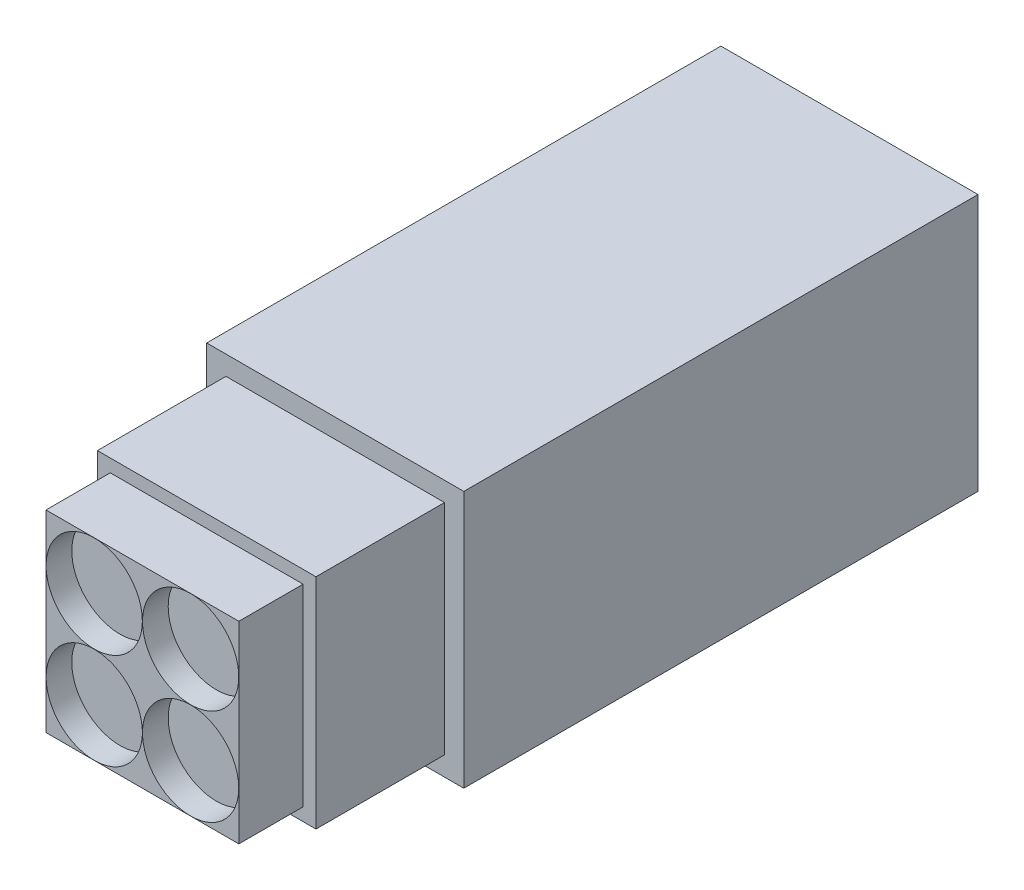
ISO-10303-21;
HEADER;
FILE_DESCRIPTION(('STEP AP214'),'2;1');
FILE_NAME('part.step','',(''),(''),'','','');
FILE_SCHEMA(('AUTOMOTIVE_DESIGN { 1 0 10303 214 1 1 1 1 }'));
ENDSEC;
DATA;
#1=APPLICATION_CONTEXT('core data for automotive mechanical design processes');
#2=APPLICATION_PROTOCOL_DEFINITION('international standard','automotive_design',2000,#1);
#3=PRODUCT_CONTEXT('',#1,'mechanical');
#4=PRODUCT('Part','Part','',(#3));
#5=PRODUCT_RELATED_PRODUCT_CATEGORY('part','',(#4));
#6=PRODUCT_DEFINITION_FORMATION('','',#4);
#7=PRODUCT_DEFINITION_CONTEXT('part definition',#1,'design');
#8=PRODUCT_DEFINITION('design','',#6,#7);
#9=PRODUCT_DEFINITION_SHAPE('','',#8);
#10=(LENGTH_UNIT() NAMED_UNIT(*) SI_UNIT(.MILLI.,.METRE.));
#11=(NAMED_UNIT(*) PLANE_ANGLE_UNIT() SI_UNIT($,.RADIAN.));
#12=(NAMED_UNIT(*) SI_UNIT($,.STERADIAN.) SOLID_ANGLE_UNIT());
#13=UNCERTAINTY_MEASURE_WITH_UNIT(LENGTH_MEASURE(1.E-05),#10,'distance_accuracy_value','');
#14=(GEOMETRIC_REPRESENTATION_CONTEXT(3) GLOBAL_UNCERTAINTY_ASSIGNED_CONTEXT((#13)) GLOBAL_UNIT_ASSIGNED_CONTEXT((#10,
#11,#12)) REPRESENTATION_CONTEXT('',''));
#15=CARTESIAN_POINT('',(0.,0.,0.));
#16=DIRECTION('',(0.,0.,1.));
#17=DIRECTION('',(1.,0.,0.));
#18=AXIS2_PLACEMENT_3D('',#15,#16,#17);
#19=CARTESIAN_POINT('',(10.,9.99999999999998,40.));
#20=DIRECTION('',(-1.,0.,0.));
#21=DIRECTION('',(0.,-1.,0.));
#22=AXIS2_PLACEMENT_3D('',#19,#20,#21);
#23=PLANE('',#22);
#24=DIRECTION('',(0.,1.,0.));
#25=VECTOR('',#24,1.);
#26=CARTESIAN_POINT('',(10.,9.99999999999998,0.));
#27=LINE('',#26,#25);
#28=CARTESIAN_POINT('',(9.99999999999999,-10.,0.));
#29=VERTEX_POINT('',#28);
#30=CARTESIAN_POINT('',(10.,9.99999999999998,0.));
#31=VERTEX_POINT('',#30);
#32=EDGE_CURVE('E202',#29,#31,#27,.T.);
#33=ORIENTED_EDGE('',*,*,#32,.T.);
#34=DIRECTION('',(0.,0.,-1.));
#35=VECTOR('',#34,1.);
#36=CARTESIAN_POINT('',(10.,9.99999999999998,40.));
#37=LINE('',#36,#35);
#38=CARTESIAN_POINT('',(10.,9.99999999999998,40.));
#39=VERTEX_POINT('',#38);
#40=EDGE_CURVE('E11',#39,#31,#37,.T.);
#41=ORIENTED_EDGE('',*,*,#40,.F.);
#42=DIRECTION('',(0.,1.,0.));
#43=VECTOR('',#42,1.);
#44=CARTESIAN_POINT('',(10.,9.99999999999998,40.));
#45=LINE('',#44,#43);
#46=CARTESIAN_POINT('',(9.99999999999999,-10.,40.));
#47=VERTEX_POINT('',#46);
#48=EDGE_CURVE('E203',#47,#39,#45,.T.);
#49=ORIENTED_EDGE('',*,*,#48,.F.);
#50=DIRECTION('',(0.,0.,-1.));
#51=VECTOR('',#50,1.);
#52=CARTESIAN_POINT('',(9.99999999999999,-10.,40.));
#53=LINE('',#52,#51);
#54=EDGE_CURVE('E217',#47,#29,#53,.T.);
#55=ORIENTED_EDGE('',*,*,#54,.T.);
#56=EDGE_LOOP('',(#33,#41,#49,#55));
#57=FACE_BOUND('',#56,.T.);
#58=ADVANCED_FACE('F39',(#57),#23,.F.);
#59=CARTESIAN_POINT('',(-10.,9.99999999999998,40.));
#60=DIRECTION('',(0.,-1.,0.));
#61=DIRECTION('',(0.,0.,-1.));
#62=AXIS2_PLACEMENT_3D('',#59,#60,#61);
#63=PLANE('',#62);
#64=DIRECTION('',(-1.,0.,0.));
#65=VECTOR('',#64,1.);
#66=CARTESIAN_POINT('',(-10.,9.99999999999998,0.));
#67=LINE('',#66,#65);
#68=CARTESIAN_POINT('',(-10.,9.99999999999998,0.));
#69=VERTEX_POINT('',#68);
#70=EDGE_CURVE('E221',#31,#69,#67,.T.);
#71=ORIENTED_EDGE('',*,*,#70,.T.);
#72=DIRECTION('',(0.,0.,-1.));
#73=VECTOR('',#72,1.);
#74=CARTESIAN_POINT('',(-10.,9.99999999999998,40.));
#75=LINE('',#74,#73);
#76=CARTESIAN_POINT('',(-10.,9.99999999999998,40.));
#77=VERTEX_POINT('',#76);
#78=EDGE_CURVE('E47',#77,#69,#75,.T.);
#79=ORIENTED_EDGE('',*,*,#78,.F.);
#80=DIRECTION('',(-1.,0.,0.));
#81=VECTOR('',#80,1.);
#82=CARTESIAN_POINT('',(-10.,9.99999999999998,40.));
#83=LINE('',#82,#81);
#84=EDGE_CURVE('E207',#39,#77,#83,.T.);
#85=ORIENTED_EDGE('',*,*,#84,.F.);
#86=ORIENTED_EDGE('',*,*,#40,.T.);
#87=EDGE_LOOP('',(#71,#79,#85,#86));
#88=FACE_BOUND('',#87,.T.);
#89=ADVANCED_FACE('F257',(#88),#63,.F.);
#90=CARTESIAN_POINT('',(-10.,9.99999999999998,40.));
#91=DIRECTION('',(1.,0.,0.));
#92=DIRECTION('',(0.,0.,-1.));
#93=AXIS2_PLACEMENT_3D('',#90,#91,#92);
#94=PLANE('',#93);
#95=DIRECTION('',(0.,-1.,0.));
#96=VECTOR('',#95,1.);
#97=CARTESIAN_POINT('',(-10.,9.99999999999998,0.));
#98=LINE('',#97,#96);
#99=CARTESIAN_POINT('',(-10.,-10.,0.));
#100=VERTEX_POINT('',#99);
#101=EDGE_CURVE('E224',#69,#100,#98,.T.);
#102=ORIENTED_EDGE('',*,*,#101,.T.);
#103=DIRECTION('',(0.,0.,-1.));
#104=VECTOR('',#103,1.);
#105=CARTESIAN_POINT('',(-10.,-10.,40.));
#106=LINE('',#105,#104);
#107=CARTESIAN_POINT('',(-10.,-10.,40.));
#108=VERTEX_POINT('',#107);
#109=EDGE_CURVE('E232',#108,#100,#106,.T.);
#110=ORIENTED_EDGE('',*,*,#109,.F.);
#111=DIRECTION('',(0.,-1.,0.));
#112=VECTOR('',#111,1.);
#113=CARTESIAN_POINT('',(-10.,9.99999999999998,40.));
#114=LINE('',#113,#112);
#115=EDGE_CURVE('E211',#77,#108,#114,.T.);
#116=ORIENTED_EDGE('',*,*,#115,.F.);
#117=ORIENTED_EDGE('',*,*,#78,.T.);
#118=EDGE_LOOP('',(#102,#110,#116,#117));
#119=FACE_BOUND('',#118,.T.);
#120=ADVANCED_FACE('F241',(#119),#94,.F.);
#121=CARTESIAN_POINT('',(-10.,-10.,40.));
#122=DIRECTION('',(0.,1.,0.));
#123=DIRECTION('',(0.,0.,1.));
#124=AXIS2_PLACEMENT_3D('',#121,#122,#123);
#125=PLANE('',#124);
#126=DIRECTION('',(1.,0.,0.));
#127=VECTOR('',#126,1.);
#128=CARTESIAN_POINT('',(-10.,-10.,0.));
#129=LINE('',#128,#127);
#130=EDGE_CURVE('E208',#100,#29,#129,.T.);
#131=ORIENTED_EDGE('',*,*,#130,.T.);
#132=ORIENTED_EDGE('',*,*,#54,.F.);
#133=DIRECTION('',(1.,0.,0.));
#134=VECTOR('',#133,1.);
#135=CARTESIAN_POINT('',(-10.,-10.,40.));
#136=LINE('',#135,#134);
#137=EDGE_CURVE('E214',#108,#47,#136,.T.);
#138=ORIENTED_EDGE('',*,*,#137,.F.);
#139=ORIENTED_EDGE('',*,*,#109,.T.);
#140=EDGE_LOOP('',(#131,#132,#138,#139));
#141=FACE_BOUND('',#140,.T.);
#142=ADVANCED_FACE('F250',(#141),#125,.F.);
#143=CARTESIAN_POINT('',(0.,0.,40.));
#144=DIRECTION('',(0.,0.,1.));
#145=DIRECTION('',(1.,0.,0.));
#146=AXIS2_PLACEMENT_3D('',#143,#144,#145);
#147=PLANE('',#146);
#148=DIRECTION('',(0.,1.,0.));
#149=VECTOR('',#148,1.);
#150=CARTESIAN_POINT('',(8.5,8.5,40.));
#151=LINE('',#150,#149);
#152=CARTESIAN_POINT('',(8.5,-8.5,40.));
#153=VERTEX_POINT('',#152);
#154=CARTESIAN_POINT('',(8.5,8.5,40.));
#155=VERTEX_POINT('',#154);
#156=EDGE_CURVE('E151',#153,#155,#151,.T.);
#157=ORIENTED_EDGE('',*,*,#156,.F.);
#158=DIRECTION('',(1.,0.,0.));
#159=VECTOR('',#158,1.);
#160=CARTESIAN_POINT('',(-8.5,-8.5,40.));
#161=LINE('',#160,#159);
#162=CARTESIAN_POINT('',(-8.5,-8.5,40.));
#163=VERTEX_POINT('',#162);
#164=EDGE_CURVE('E167',#163,#153,#161,.T.);
#165=ORIENTED_EDGE('',*,*,#164,.F.);
#166=DIRECTION('',(0.,-1.,0.));
#167=VECTOR('',#166,1.);
#168=CARTESIAN_POINT('',(-8.5,8.5,40.));
#169=LINE('',#168,#167);
#170=CARTESIAN_POINT('',(-8.5,8.5,40.));
#171=VERTEX_POINT('',#170);
#172=EDGE_CURVE('E180',#171,#163,#169,.T.);
#173=ORIENTED_EDGE('',*,*,#172,.F.);
#174=DIRECTION('',(-1.,0.,0.));
#175=VECTOR('',#174,1.);
#176=CARTESIAN_POINT('',(-8.5,8.5,40.));
#177=LINE('',#176,#175);
#178=EDGE_CURVE('E156',#155,#171,#177,.T.);
#179=ORIENTED_EDGE('',*,*,#178,.F.);
#180=EDGE_LOOP('',(#157,#165,#173,#179));
#181=FACE_BOUND('',#180,.T.);
#182=ORIENTED_EDGE('',*,*,#48,.T.);
#183=ORIENTED_EDGE('',*,*,#84,.T.);
#184=ORIENTED_EDGE('',*,*,#115,.T.);
#185=ORIENTED_EDGE('',*,*,#137,.T.);
#186=EDGE_LOOP('',(#182,#183,#184,#185));
#187=FACE_BOUND('',#186,.T.);
#188=ADVANCED_FACE('F256',(#181,#187),#147,.T.);
#189=CARTESIAN_POINT('',(0.,0.,0.));
#190=DIRECTION('',(0.,0.,1.));
#191=DIRECTION('',(1.,0.,0.));
#192=AXIS2_PLACEMENT_3D('',#189,#190,#191);
#193=PLANE('',#192);
#194=ORIENTED_EDGE('',*,*,#32,.F.);
#195=ORIENTED_EDGE('',*,*,#130,.F.);
#196=ORIENTED_EDGE('',*,*,#101,.F.);
#197=ORIENTED_EDGE('',*,*,#70,.F.);
#198=EDGE_LOOP('',(#194,#195,#196,#197));
#199=FACE_BOUND('',#198,.T.);
#200=ADVANCED_FACE('F247',(#199),#193,.F.);
#201=CARTESIAN_POINT('',(8.5,8.5,50.));
#202=DIRECTION('',(-1.,0.,0.));
#203=DIRECTION('',(0.,-1.,0.));
#204=AXIS2_PLACEMENT_3D('',#201,#202,#203);
#205=PLANE('',#204);
#206=ORIENTED_EDGE('',*,*,#156,.T.);
#207=DIRECTION('',(0.,0.,-1.));
#208=VECTOR('',#207,1.);
#209=CARTESIAN_POINT('',(8.5,8.5,50.));
#210=LINE('',#209,#208);
#211=CARTESIAN_POINT('',(8.5,8.5,50.));
#212=VERTEX_POINT('',#211);
#213=EDGE_CURVE('E198',#212,#155,#210,.T.);
#214=ORIENTED_EDGE('',*,*,#213,.F.);
#215=DIRECTION('',(0.,1.,0.));
#216=VECTOR('',#215,1.);
#217=CARTESIAN_POINT('',(8.5,8.5,50.));
#218=LINE('',#217,#216);
#219=CARTESIAN_POINT('',(8.5,-8.5,50.));
#220=VERTEX_POINT('',#219);
#221=EDGE_CURVE('E162',#220,#212,#218,.T.);
#222=ORIENTED_EDGE('',*,*,#221,.F.);
#223=DIRECTION('',(0.,0.,-1.));
#224=VECTOR('',#223,1.);
#225=CARTESIAN_POINT('',(8.5,-8.5,50.));
#226=LINE('',#225,#224);
#227=EDGE_CURVE('E175',#220,#153,#226,.T.);
#228=ORIENTED_EDGE('',*,*,#227,.T.);
#229=EDGE_LOOP('',(#206,#214,#222,#228));
#230=FACE_BOUND('',#229,.T.);
#231=ADVANCED_FACE('F269',(#230),#205,.F.);
#232=CARTESIAN_POINT('',(-8.5,8.5,50.));
#233=DIRECTION('',(0.,-1.,0.));
#234=DIRECTION('',(0.,0.,-1.));
#235=AXIS2_PLACEMENT_3D('',#232,#233,#234);
#236=PLANE('',#235);
#237=ORIENTED_EDGE('',*,*,#178,.T.);
#238=DIRECTION('',(0.,0.,-1.));
#239=VECTOR('',#238,1.);
#240=CARTESIAN_POINT('',(-8.5,8.5,50.));
#241=LINE('',#240,#239);
#242=CARTESIAN_POINT('',(-8.5,8.5,50.));
#243=VERTEX_POINT('',#242);
#244=EDGE_CURVE('E194',#243,#171,#241,.T.);
#245=ORIENTED_EDGE('',*,*,#244,.F.);
#246=DIRECTION('',(-1.,0.,0.));
#247=VECTOR('',#246,1.);
#248=CARTESIAN_POINT('',(-8.5,8.5,50.));
#249=LINE('',#248,#247);
#250=EDGE_CURVE('E166',#212,#243,#249,.T.);
#251=ORIENTED_EDGE('',*,*,#250,.F.);
#252=ORIENTED_EDGE('',*,*,#213,.T.);
#253=EDGE_LOOP('',(#237,#245,#251,#252));
#254=FACE_BOUND('',#253,.T.);
#255=ADVANCED_FACE('F275',(#254),#236,.F.);
#256=CARTESIAN_POINT('',(-8.5,8.5,50.));
#257=DIRECTION('',(1.,0.,0.));
#258=DIRECTION('',(0.,1.,0.));
#259=AXIS2_PLACEMENT_3D('',#256,#257,#258);
#260=PLANE('',#259);
#261=ORIENTED_EDGE('',*,*,#172,.T.);
#262=DIRECTION('',(0.,0.,-1.));
#263=VECTOR('',#262,1.);
#264=CARTESIAN_POINT('',(-8.5,-8.5,50.));
#265=LINE('',#264,#263);
#266=CARTESIAN_POINT('',(-8.5,-8.5,50.));
#267=VERTEX_POINT('',#266);
#268=EDGE_CURVE('E190',#267,#163,#265,.T.);
#269=ORIENTED_EDGE('',*,*,#268,.F.);
#270=DIRECTION('',(0.,-1.,0.));
#271=VECTOR('',#270,1.);
#272=CARTESIAN_POINT('',(-8.5,8.5,50.));
#273=LINE('',#272,#271);
#274=EDGE_CURVE('E170',#243,#267,#273,.T.);
#275=ORIENTED_EDGE('',*,*,#274,.F.);
#276=ORIENTED_EDGE('',*,*,#244,.T.);
#277=EDGE_LOOP('',(#261,#269,#275,#276));
#278=FACE_BOUND('',#277,.T.);
#279=ADVANCED_FACE('F279',(#278),#260,.F.);
#280=CARTESIAN_POINT('',(-8.5,-8.5,50.));
#281=DIRECTION('',(0.,1.,0.));
#282=DIRECTION('',(0.,0.,1.));
#283=AXIS2_PLACEMENT_3D('',#280,#281,#282);
#284=PLANE('',#283);
#285=ORIENTED_EDGE('',*,*,#164,.T.);
#286=ORIENTED_EDGE('',*,*,#227,.F.);
#287=DIRECTION('',(1.,0.,0.));
#288=VECTOR('',#287,1.);
#289=CARTESIAN_POINT('',(-8.5,-8.5,50.));
#290=LINE('',#289,#288);
#291=EDGE_CURVE('E173',#267,#220,#290,.T.);
#292=ORIENTED_EDGE('',*,*,#291,.F.);
#293=ORIENTED_EDGE('',*,*,#268,.T.);
#294=EDGE_LOOP('',(#285,#286,#292,#293));
#295=FACE_BOUND('',#294,.T.);
#296=ADVANCED_FACE('F283',(#295),#284,.F.);
#297=CARTESIAN_POINT('',(0.,0.,50.));
#298=DIRECTION('',(0.,0.,1.));
#299=DIRECTION('',(1.,0.,0.));
#300=AXIS2_PLACEMENT_3D('',#297,#298,#299);
#301=PLANE('',#300);
#302=DIRECTION('',(0.,1.,0.));
#303=VECTOR('',#302,1.);
#304=CARTESIAN_POINT('',(7.5,7.5,50.));
#305=LINE('',#304,#303);
#306=CARTESIAN_POINT('',(7.5,-7.5,50.));
#307=VERTEX_POINT('',#306);
#308=CARTESIAN_POINT('',(7.5,7.5,50.));
#309=VERTEX_POINT('',#308);
#310=EDGE_CURVE('E54',#307,#309,#305,.T.);
#311=ORIENTED_EDGE('',*,*,#310,.F.);
#312=DIRECTION('',(1.,0.,0.));
#313=VECTOR('',#312,1.);
#314=CARTESIAN_POINT('',(-7.5,-7.5,50.));
#315=LINE('',#314,#313);
#316=CARTESIAN_POINT('',(-7.5,-7.5,50.));
#317=VERTEX_POINT('',#316);
#318=EDGE_CURVE('E58',#317,#307,#315,.T.);
#319=ORIENTED_EDGE('',*,*,#318,.F.);
#320=DIRECTION('',(0.,-1.,0.));
#321=VECTOR('',#320,1.);
#322=CARTESIAN_POINT('',(-7.5,7.5,50.));
#323=LINE('',#322,#321);
#324=CARTESIAN_POINT('',(-7.5,7.5,50.));
#325=VERTEX_POINT('',#324);
#326=EDGE_CURVE('E383',#325,#317,#323,.T.);
#327=ORIENTED_EDGE('',*,*,#326,.F.);
#328=DIRECTION('',(-1.,0.,0.));
#329=VECTOR('',#328,1.);
#330=CARTESIAN_POINT('',(-7.5,7.5,50.));
#331=LINE('',#330,#329);
#332=EDGE_CURVE('E380',#309,#325,#331,.T.);
#333=ORIENTED_EDGE('',*,*,#332,.F.);
#334=EDGE_LOOP('',(#311,#319,#327,#333));
#335=FACE_BOUND('',#334,.T.);
#336=ORIENTED_EDGE('',*,*,#221,.T.);
#337=ORIENTED_EDGE('',*,*,#250,.T.);
#338=ORIENTED_EDGE('',*,*,#274,.T.);
#339=ORIENTED_EDGE('',*,*,#291,.T.);
#340=EDGE_LOOP('',(#336,#337,#338,#339));
#341=FACE_BOUND('',#340,.T.);
#342=ADVANCED_FACE('F287',(#335,#341),#301,.T.);
#343=CARTESIAN_POINT('',(7.5,7.5,55.));
#344=DIRECTION('',(-1.,0.,0.));
#345=DIRECTION('',(0.,-1.,0.));
#346=AXIS2_PLACEMENT_3D('',#343,#344,#345);
#347=PLANE('',#346);
#348=ORIENTED_EDGE('',*,*,#310,.T.);
#349=DIRECTION('',(0.,0.,-1.));
#350=VECTOR('',#349,1.);
#351=CARTESIAN_POINT('',(7.5,7.5,55.));
#352=LINE('',#351,#350);
#353=CARTESIAN_POINT('',(7.5,7.5,55.));
#354=VERTEX_POINT('',#353);
#355=EDGE_CURVE('E131',#354,#309,#352,.T.);
#356=ORIENTED_EDGE('',*,*,#355,.F.);
#357=DIRECTION('',(0.,1.,0.));
#358=VECTOR('',#357,1.);
#359=CARTESIAN_POINT('',(7.5,7.5,55.));
#360=LINE('',#359,#358);
#361=CARTESIAN_POINT('',(7.5,-7.5,55.));
#362=VERTEX_POINT('',#361);
#363=EDGE_CURVE('E138',#362,#354,#360,.T.);
#364=ORIENTED_EDGE('',*,*,#363,.F.);
#365=DIRECTION('',(0.,0.,-1.));
#366=VECTOR('',#365,1.);
#367=CARTESIAN_POINT('',(7.5,-7.5,55.));
#368=LINE('',#367,#366);
#369=EDGE_CURVE('E377',#362,#307,#368,.T.);
#370=ORIENTED_EDGE('',*,*,#369,.T.);
#371=EDGE_LOOP('',(#348,#356,#364,#370));
#372=FACE_BOUND('',#371,.T.);
#373=ADVANCED_FACE('F149',(#372),#347,.F.);
#374=CARTESIAN_POINT('',(-7.5,7.5,55.));
#375=DIRECTION('',(0.,-1.,0.));
#376=DIRECTION('',(0.,0.,-1.));
#377=AXIS2_PLACEMENT_3D('',#374,#375,#376);
#378=PLANE('',#377);
#379=ORIENTED_EDGE('',*,*,#332,.T.);
#380=DIRECTION('',(0.,0.,-1.));
#381=VECTOR('',#380,1.);
#382=CARTESIAN_POINT('',(-7.5,7.5,55.));
#383=LINE('',#382,#381);
#384=CARTESIAN_POINT('',(-7.5,7.5,55.));
#385=VERTEX_POINT('',#384);
#386=EDGE_CURVE('E133',#385,#325,#383,.T.);
#387=ORIENTED_EDGE('',*,*,#386,.F.);
#388=DIRECTION('',(-1.,0.,0.));
#389=VECTOR('',#388,1.);
#390=CARTESIAN_POINT('',(-7.5,7.5,55.));
#391=LINE('',#390,#389);
#392=EDGE_CURVE('E126',#354,#385,#391,.T.);
#393=ORIENTED_EDGE('',*,*,#392,.F.);
#394=ORIENTED_EDGE('',*,*,#355,.T.);
#395=EDGE_LOOP('',(#379,#387,#393,#394));
#396=FACE_BOUND('',#395,.T.);
#397=ADVANCED_FACE('F129',(#396),#378,.F.);
#398=CARTESIAN_POINT('',(-7.5,7.5,55.));
#399=DIRECTION('',(1.,0.,0.));
#400=DIRECTION('',(0.,1.,0.));
#401=AXIS2_PLACEMENT_3D('',#398,#399,#400);
#402=PLANE('',#401);
#403=ORIENTED_EDGE('',*,*,#326,.T.);
#404=DIRECTION('',(0.,0.,-1.));
#405=VECTOR('',#404,1.);
#406=CARTESIAN_POINT('',(-7.5,-7.5,55.));
#407=LINE('',#406,#405);
#408=CARTESIAN_POINT('',(-7.5,-7.5,55.));
#409=VERTEX_POINT('',#408);
#410=EDGE_CURVE('E158',#409,#317,#407,.T.);
#411=ORIENTED_EDGE('',*,*,#410,.F.);
#412=DIRECTION('',(0.,-1.,0.));
#413=VECTOR('',#412,1.);
#414=CARTESIAN_POINT('',(-7.5,7.5,55.));
#415=LINE('',#414,#413);
#416=EDGE_CURVE('E137',#385,#409,#415,.T.);
#417=ORIENTED_EDGE('',*,*,#416,.F.);
#418=ORIENTED_EDGE('',*,*,#386,.T.);
#419=EDGE_LOOP('',(#403,#411,#417,#418));
#420=FACE_BOUND('',#419,.T.);
#421=ADVANCED_FACE('F295',(#420),#402,.F.);
#422=CARTESIAN_POINT('',(-7.5,-7.5,55.));
#423=DIRECTION('',(0.,1.,0.));
#424=DIRECTION('',(0.,0.,1.));
#425=AXIS2_PLACEMENT_3D('',#422,#423,#424);
#426=PLANE('',#425);
#427=ORIENTED_EDGE('',*,*,#318,.T.);
#428=ORIENTED_EDGE('',*,*,#369,.F.);
#429=DIRECTION('',(1.,0.,0.));
#430=VECTOR('',#429,1.);
#431=CARTESIAN_POINT('',(-7.5,-7.5,55.));
#432=LINE('',#431,#430);
#433=EDGE_CURVE('E143',#409,#362,#432,.T.);
#434=ORIENTED_EDGE('',*,*,#433,.F.);
#435=ORIENTED_EDGE('',*,*,#410,.T.);
#436=EDGE_LOOP('',(#427,#428,#434,#435));
#437=FACE_BOUND('',#436,.T.);
#438=ADVANCED_FACE('F298',(#437),#426,.F.);
#439=CARTESIAN_POINT('',(0.,0.,55.));
#440=DIRECTION('',(0.,0.,1.));
#441=DIRECTION('',(1.,0.,0.));
#442=AXIS2_PLACEMENT_3D('',#439,#440,#441);
#443=PLANE('',#442);
#444=CARTESIAN_POINT('',(-3.75,-3.75,55.));
#445=DIRECTION('',(0.,0.,1.));
#446=DIRECTION('',(-1.,0.,0.));
#447=AXIS2_PLACEMENT_3D('',#444,#445,#446);
#448=CIRCLE('',#447,3.745);
#449=CARTESIAN_POINT('',(-7.495,-3.75,55.));
#450=VERTEX_POINT('',#449);
#451=EDGE_CURVE('E366',#450,#450,#448,.T.);
#452=ORIENTED_EDGE('',*,*,#451,.F.);
#453=EDGE_LOOP('',(#452));
#454=FACE_BOUND('',#453,.T.);
#455=CARTESIAN_POINT('',(3.75,-3.75,55.));
#456=DIRECTION('',(0.,0.,1.));
#457=DIRECTION('',(1.,0.,0.));
#458=AXIS2_PLACEMENT_3D('',#455,#456,#457);
#459=CIRCLE('',#458,3.745);
#460=CARTESIAN_POINT('',(7.495,-3.75,55.));
#461=VERTEX_POINT('',#460);
#462=EDGE_CURVE('E358',#461,#461,#459,.T.);
#463=ORIENTED_EDGE('',*,*,#462,.F.);
#464=EDGE_LOOP('',(#463));
#465=FACE_BOUND('',#464,.T.);
#466=CARTESIAN_POINT('',(3.75,3.75,55.));
#467=DIRECTION('',(0.,0.,1.));
#468=DIRECTION('',(-1.,0.,0.));
#469=AXIS2_PLACEMENT_3D('',#466,#467,#468);
#470=CIRCLE('',#469,3.745);
#471=CARTESIAN_POINT('',(0.00500000000000023,3.75,55.));
#472=VERTEX_POINT('',#471);
#473=EDGE_CURVE('E344',#472,#472,#470,.T.);
#474=ORIENTED_EDGE('',*,*,#473,.F.);
#475=EDGE_LOOP('',(#474));
#476=FACE_BOUND('',#475,.T.);
#477=CARTESIAN_POINT('',(-3.75,3.75,55.));
#478=DIRECTION('',(0.,0.,1.));
#479=DIRECTION('',(1.,0.,0.));
#480=AXIS2_PLACEMENT_3D('',#477,#478,#479);
#481=CIRCLE('',#480,3.745);
#482=CARTESIAN_POINT('',(-0.00499999999999806,3.75,55.));
#483=VERTEX_POINT('',#482);
#484=EDGE_CURVE('E343',#483,#483,#481,.T.);
#485=ORIENTED_EDGE('',*,*,#484,.F.);
#486=EDGE_LOOP('',(#485));
#487=FACE_BOUND('',#486,.T.);
#488=ORIENTED_EDGE('',*,*,#363,.T.);
#489=ORIENTED_EDGE('',*,*,#392,.T.);
#490=ORIENTED_EDGE('',*,*,#416,.T.);
#491=ORIENTED_EDGE('',*,*,#433,.T.);
#492=EDGE_LOOP('',(#488,#489,#490,#491));
#493=FACE_BOUND('',#492,.T.);
#494=ADVANCED_FACE('F141',(#454,#465,#476,#487,#493),#443,.T.);
#495=CARTESIAN_POINT('',(-3.75,3.75,53.));
#496=DIRECTION('',(0.,0.,1.));
#497=DIRECTION('',(1.,0.,0.));
#498=AXIS2_PLACEMENT_3D('',#495,#496,#497);
#499=CYLINDRICAL_SURFACE('',#498,3.745);
#500=CARTESIAN_POINT('',(-3.75,3.75,53.));
#501=DIRECTION('',(0.,0.,1.));
#502=DIRECTION('',(1.,0.,0.));
#503=AXIS2_PLACEMENT_3D('',#500,#501,#502);
#504=CIRCLE('',#503,3.745);
#505=CARTESIAN_POINT('',(-0.00499999999999806,3.75,53.));
#506=VERTEX_POINT('',#505);
#507=EDGE_CURVE('E349',#506,#506,#504,.T.);
#508=ORIENTED_EDGE('',*,*,#507,.F.);
#509=EDGE_LOOP('',(#508));
#510=FACE_BOUND('',#509,.T.);
#511=ORIENTED_EDGE('',*,*,#484,.T.);
#512=EDGE_LOOP('',(#511));
#513=FACE_BOUND('',#512,.T.);
#514=ADVANCED_FACE('F305',(#510,#513),#499,.F.);
#515=CARTESIAN_POINT('',(-3.75,3.75,53.));
#516=DIRECTION('',(0.,0.,1.));
#517=DIRECTION('',(1.,0.,0.));
#518=AXIS2_PLACEMENT_3D('',#515,#516,#517);
#519=PLANE('',#518);
#520=ORIENTED_EDGE('',*,*,#507,.T.);
#521=EDGE_LOOP('',(#520));
#522=FACE_BOUND('',#521,.T.);
#523=ADVANCED_FACE('F309',(#522),#519,.T.);
#524=CARTESIAN_POINT('',(3.75,3.75,53.));
#525=DIRECTION('',(0.,0.,1.));
#526=DIRECTION('',(1.,0.,0.));
#527=AXIS2_PLACEMENT_3D('',#524,#525,#526);
#528=CYLINDRICAL_SURFACE('',#527,3.745);
#529=CARTESIAN_POINT('',(3.75,3.75,53.));
#530=DIRECTION('',(0.,0.,1.));
#531=DIRECTION('',(-1.,0.,0.));
#532=AXIS2_PLACEMENT_3D('',#529,#530,#531);
#533=CIRCLE('',#532,3.745);
#534=CARTESIAN_POINT('',(0.00500000000000023,3.75,53.));
#535=VERTEX_POINT('',#534);
#536=EDGE_CURVE('E341',#535,#535,#533,.T.);
#537=ORIENTED_EDGE('',*,*,#536,.F.);
#538=EDGE_LOOP('',(#537));
#539=FACE_BOUND('',#538,.T.);
#540=ORIENTED_EDGE('',*,*,#473,.T.);
#541=EDGE_LOOP('',(#540));
#542=FACE_BOUND('',#541,.T.);
#543=ADVANCED_FACE('F313',(#539,#542),#528,.F.);
#544=CARTESIAN_POINT('',(3.75,3.75,53.));
#545=DIRECTION('',(0.,0.,-1.));
#546=DIRECTION('',(-1.,0.,0.));
#547=AXIS2_PLACEMENT_3D('',#544,#545,#546);
#548=PLANE('',#547);
#549=ORIENTED_EDGE('',*,*,#536,.T.);
#550=EDGE_LOOP('',(#549));
#551=FACE_BOUND('',#550,.T.);
#552=ADVANCED_FACE('F327',(#551),#548,.F.);
#553=CARTESIAN_POINT('',(3.75,-3.75,53.));
#554=DIRECTION('',(0.,0.,1.));
#555=DIRECTION('',(1.,0.,0.));
#556=AXIS2_PLACEMENT_3D('',#553,#554,#555);
#557=CYLINDRICAL_SURFACE('',#556,3.745);
#558=CARTESIAN_POINT('',(3.75,-3.75,53.));
#559=DIRECTION('',(0.,0.,1.));
#560=DIRECTION('',(1.,0.,0.));
#561=AXIS2_PLACEMENT_3D('',#558,#559,#560);
#562=CIRCLE('',#561,3.745);
#563=CARTESIAN_POINT('',(7.495,-3.75,53.));
#564=VERTEX_POINT('',#563);
#565=EDGE_CURVE('E352',#564,#564,#562,.T.);
#566=ORIENTED_EDGE('',*,*,#565,.F.);
#567=EDGE_LOOP('',(#566));
#568=FACE_BOUND('',#567,.T.);
#569=ORIENTED_EDGE('',*,*,#462,.T.);
#570=EDGE_LOOP('',(#569));
#571=FACE_BOUND('',#570,.T.);
#572=ADVANCED_FACE('F324',(#568,#571),#557,.F.);
#573=CARTESIAN_POINT('',(3.75,-3.75,53.));
#574=DIRECTION('',(0.,0.,1.));
#575=DIRECTION('',(1.,0.,0.));
#576=AXIS2_PLACEMENT_3D('',#573,#574,#575);
#577=PLANE('',#576);
#578=ORIENTED_EDGE('',*,*,#565,.T.);
#579=EDGE_LOOP('',(#578));
#580=FACE_BOUND('',#579,.T.);
#581=ADVANCED_FACE('F319',(#580),#577,.T.);
#582=CARTESIAN_POINT('',(-3.75,-3.75,53.));
#583=DIRECTION('',(0.,0.,1.));
#584=DIRECTION('',(1.,0.,0.));
#585=AXIS2_PLACEMENT_3D('',#582,#583,#584);
#586=CYLINDRICAL_SURFACE('',#585,3.745);
#587=CARTESIAN_POINT('',(-3.75,-3.75,53.));
#588=DIRECTION('',(0.,0.,1.));
#589=DIRECTION('',(-1.,0.,0.));
#590=AXIS2_PLACEMENT_3D('',#587,#588,#589);
#591=CIRCLE('',#590,3.745);
#592=CARTESIAN_POINT('',(-7.495,-3.75,53.));
#593=VERTEX_POINT('',#592);
#594=EDGE_CURVE('E362',#593,#593,#591,.T.);
#595=ORIENTED_EDGE('',*,*,#594,.F.);
#596=EDGE_LOOP('',(#595));
#597=FACE_BOUND('',#596,.T.);
#598=ORIENTED_EDGE('',*,*,#451,.T.);
#599=EDGE_LOOP('',(#598));
#600=FACE_BOUND('',#599,.T.);
#601=ADVANCED_FACE('F315',(#597,#600),#586,.F.);
#602=CARTESIAN_POINT('',(-3.75,-3.75,53.));
#603=DIRECTION('',(0.,0.,-1.));
#604=DIRECTION('',(-1.,0.,0.));
#605=AXIS2_PLACEMENT_3D('',#602,#603,#604);
#606=PLANE('',#605);
#607=ORIENTED_EDGE('',*,*,#594,.T.);
#608=EDGE_LOOP('',(#607));
#609=FACE_BOUND('',#608,.T.);
#610=ADVANCED_FACE('F318',(#609),#606,.F.);
#611=CLOSED_SHELL('',(#58,#89,#120,#142,#188,#200,#231,#255,#279,#296,#342,#373,#397,#421,#438,
#494,#514,#523,#543,#552,#572,#581,#601,#610));
#612=MANIFOLD_SOLID_BREP('B2',#611);
#613=ADVANCED_BREP_SHAPE_REPRESENTATION('',(#18,#612),#14);
#614=SHAPE_DEFINITION_REPRESENTATION(#9,#613);
ENDSEC;
END-ISO-10303-21;
